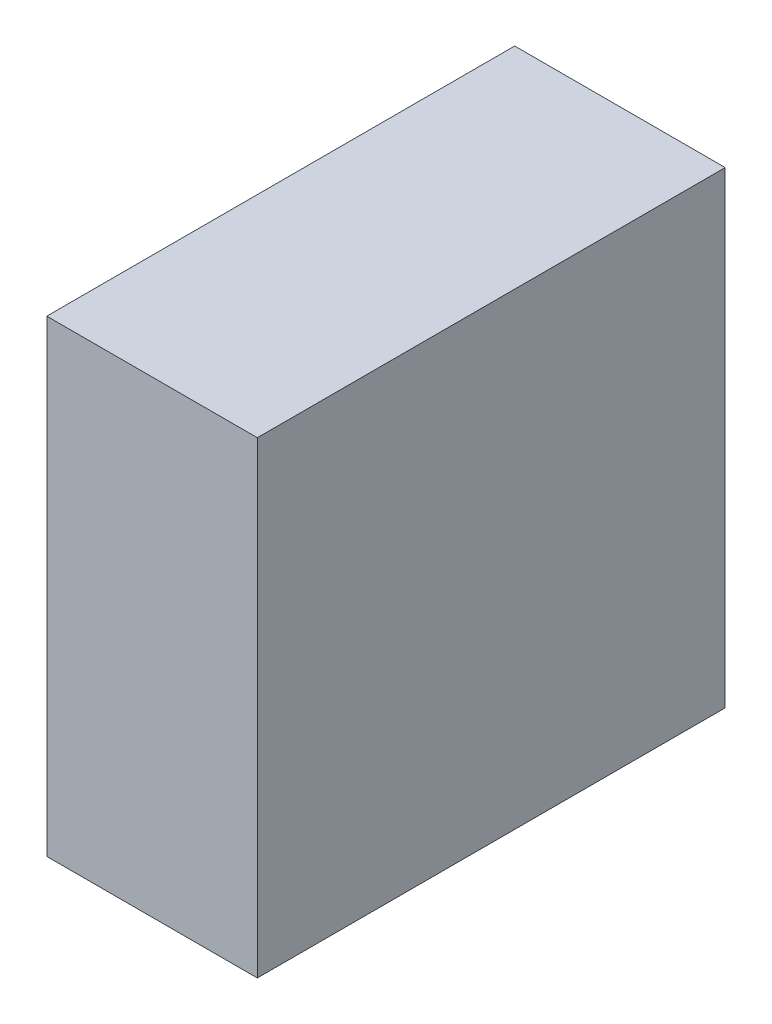
ISO-10303-21;
HEADER;
FILE_DESCRIPTION(('STEP AP214'),'2;1');
FILE_NAME('part.step','',(''),(''),'','','');
FILE_SCHEMA(('AUTOMOTIVE_DESIGN { 1 0 10303 214 1 1 1 1 }'));
ENDSEC;
DATA;
#1=APPLICATION_CONTEXT('core data for automotive mechanical design processes');
#2=APPLICATION_PROTOCOL_DEFINITION('international standard','automotive_design',2000,#1);
#3=PRODUCT_CONTEXT('',#1,'mechanical');
#4=PRODUCT('Part','Part','',(#3));
#5=PRODUCT_RELATED_PRODUCT_CATEGORY('part','',(#4));
#6=PRODUCT_DEFINITION_FORMATION('','',#4);
#7=PRODUCT_DEFINITION_CONTEXT('part definition',#1,'design');
#8=PRODUCT_DEFINITION('design','',#6,#7);
#9=PRODUCT_DEFINITION_SHAPE('','',#8);
#10=(LENGTH_UNIT() NAMED_UNIT(*) SI_UNIT(.MILLI.,.METRE.));
#11=(NAMED_UNIT(*) PLANE_ANGLE_UNIT() SI_UNIT($,.RADIAN.));
#12=(NAMED_UNIT(*) SI_UNIT($,.STERADIAN.) SOLID_ANGLE_UNIT());
#13=UNCERTAINTY_MEASURE_WITH_UNIT(LENGTH_MEASURE(1.E-05),#10,'distance_accuracy_value','');
#14=(GEOMETRIC_REPRESENTATION_CONTEXT(3) GLOBAL_UNCERTAINTY_ASSIGNED_CONTEXT((#13)) GLOBAL_UNIT_ASSIGNED_CONTEXT((#10,
#11,#12)) REPRESENTATION_CONTEXT('',''));
#15=CARTESIAN_POINT('',(0.,0.,0.));
#16=DIRECTION('',(0.,0.,1.));
#17=DIRECTION('',(1.,0.,0.));
#18=AXIS2_PLACEMENT_3D('',#15,#16,#17);
#19=CARTESIAN_POINT('',(390.,180.,-248.));
#20=DIRECTION('',(-1.,0.,0.));
#21=DIRECTION('',(0.,0.,1.));
#22=AXIS2_PLACEMENT_3D('',#19,#20,#21);
#23=PLANE('',#22);
#24=DIRECTION('',(0.,-1.,0.));
#25=VECTOR('',#24,1.);
#26=CARTESIAN_POINT('',(390.,180.,-148.));
#27=LINE('',#26,#25);
#28=CARTESIAN_POINT('',(390.,280.,-148.));
#29=VERTEX_POINT('',#28);
#30=CARTESIAN_POINT('',(390.,180.,-148.));
#31=VERTEX_POINT('',#30);
#32=EDGE_CURVE('E103',#29,#31,#27,.T.);
#33=ORIENTED_EDGE('',*,*,#32,.F.);
#34=DIRECTION('',(0.,0.,1.));
#35=VECTOR('',#34,1.);
#36=CARTESIAN_POINT('',(390.,280.,-248.));
#37=LINE('',#36,#35);
#38=CARTESIAN_POINT('',(390.,280.,-248.));
#39=VERTEX_POINT('',#38);
#40=EDGE_CURVE('E11',#39,#29,#37,.T.);
#41=ORIENTED_EDGE('',*,*,#40,.F.);
#42=DIRECTION('',(0.,-1.,0.));
#43=VECTOR('',#42,1.);
#44=CARTESIAN_POINT('',(390.,180.,-248.));
#45=LINE('',#44,#43);
#46=CARTESIAN_POINT('',(390.,180.,-248.));
#47=VERTEX_POINT('',#46);
#48=EDGE_CURVE('E97',#39,#47,#45,.T.);
#49=ORIENTED_EDGE('',*,*,#48,.T.);
#50=DIRECTION('',(0.,0.,1.));
#51=VECTOR('',#50,1.);
#52=CARTESIAN_POINT('',(390.,180.,-248.));
#53=LINE('',#52,#51);
#54=EDGE_CURVE('E42',#47,#31,#53,.T.);
#55=ORIENTED_EDGE('',*,*,#54,.T.);
#56=EDGE_LOOP('',(#33,#41,#49,#55));
#57=FACE_BOUND('',#56,.T.);
#58=ADVANCED_FACE('F39',(#57),#23,.T.);
#59=CARTESIAN_POINT('',(390.,280.,-248.));
#60=DIRECTION('',(0.,1.,0.));
#61=DIRECTION('',(0.,0.,1.));
#62=AXIS2_PLACEMENT_3D('',#59,#60,#61);
#63=PLANE('',#62);
#64=DIRECTION('',(-1.,0.,0.));
#65=VECTOR('',#64,1.);
#66=CARTESIAN_POINT('',(390.,280.,-148.));
#67=LINE('',#66,#65);
#68=CARTESIAN_POINT('',(435.,280.,-148.));
#69=VERTEX_POINT('',#68);
#70=EDGE_CURVE('E99',#69,#29,#67,.T.);
#71=ORIENTED_EDGE('',*,*,#70,.F.);
#72=DIRECTION('',(0.,0.,1.));
#73=VECTOR('',#72,1.);
#74=CARTESIAN_POINT('',(435.,280.,-248.));
#75=LINE('',#74,#73);
#76=CARTESIAN_POINT('',(435.,280.,-248.));
#77=VERTEX_POINT('',#76);
#78=EDGE_CURVE('E48',#77,#69,#75,.T.);
#79=ORIENTED_EDGE('',*,*,#78,.F.);
#80=DIRECTION('',(-1.,0.,0.));
#81=VECTOR('',#80,1.);
#82=CARTESIAN_POINT('',(390.,280.,-248.));
#83=LINE('',#82,#81);
#84=EDGE_CURVE('E94',#77,#39,#83,.T.);
#85=ORIENTED_EDGE('',*,*,#84,.T.);
#86=ORIENTED_EDGE('',*,*,#40,.T.);
#87=EDGE_LOOP('',(#71,#79,#85,#86));
#88=FACE_BOUND('',#87,.T.);
#89=ADVANCED_FACE('F113',(#88),#63,.T.);
#90=CARTESIAN_POINT('',(435.,180.,-248.));
#91=DIRECTION('',(1.,0.,0.));
#92=DIRECTION('',(0.,0.,-1.));
#93=AXIS2_PLACEMENT_3D('',#90,#91,#92);
#94=PLANE('',#93);
#95=DIRECTION('',(0.,1.,0.));
#96=VECTOR('',#95,1.);
#97=CARTESIAN_POINT('',(435.,180.,-148.));
#98=LINE('',#97,#96);
#99=CARTESIAN_POINT('',(435.,180.,-148.));
#100=VERTEX_POINT('',#99);
#101=EDGE_CURVE('E89',#100,#69,#98,.T.);
#102=ORIENTED_EDGE('',*,*,#101,.F.);
#103=DIRECTION('',(0.,0.,1.));
#104=VECTOR('',#103,1.);
#105=CARTESIAN_POINT('',(435.,180.,-248.));
#106=LINE('',#105,#104);
#107=CARTESIAN_POINT('',(435.,180.,-248.));
#108=VERTEX_POINT('',#107);
#109=EDGE_CURVE('E84',#108,#100,#106,.T.);
#110=ORIENTED_EDGE('',*,*,#109,.F.);
#111=DIRECTION('',(0.,1.,0.));
#112=VECTOR('',#111,1.);
#113=CARTESIAN_POINT('',(435.,180.,-248.));
#114=LINE('',#113,#112);
#115=EDGE_CURVE('E87',#108,#77,#114,.T.);
#116=ORIENTED_EDGE('',*,*,#115,.T.);
#117=ORIENTED_EDGE('',*,*,#78,.T.);
#118=EDGE_LOOP('',(#102,#110,#116,#117));
#119=FACE_BOUND('',#118,.T.);
#120=ADVANCED_FACE('F86',(#119),#94,.T.);
#121=CARTESIAN_POINT('',(390.,180.,-248.));
#122=DIRECTION('',(0.,-1.,0.));
#123=DIRECTION('',(0.,0.,-1.));
#124=AXIS2_PLACEMENT_3D('',#121,#122,#123);
#125=PLANE('',#124);
#126=DIRECTION('',(1.,0.,0.));
#127=VECTOR('',#126,1.);
#128=CARTESIAN_POINT('',(390.,180.,-148.));
#129=LINE('',#128,#127);
#130=EDGE_CURVE('E106',#31,#100,#129,.T.);
#131=ORIENTED_EDGE('',*,*,#130,.F.);
#132=ORIENTED_EDGE('',*,*,#54,.F.);
#133=DIRECTION('',(1.,0.,0.));
#134=VECTOR('',#133,1.);
#135=CARTESIAN_POINT('',(390.,180.,-248.));
#136=LINE('',#135,#134);
#137=EDGE_CURVE('E93',#47,#108,#136,.T.);
#138=ORIENTED_EDGE('',*,*,#137,.T.);
#139=ORIENTED_EDGE('',*,*,#109,.T.);
#140=EDGE_LOOP('',(#131,#132,#138,#139));
#141=FACE_BOUND('',#140,.T.);
#142=ADVANCED_FACE('F96',(#141),#125,.T.);
#143=CARTESIAN_POINT('',(0.,0.,-248.));
#144=DIRECTION('',(0.,0.,-1.));
#145=DIRECTION('',(-1.,0.,0.));
#146=AXIS2_PLACEMENT_3D('',#143,#144,#145);
#147=PLANE('',#146);
#148=ORIENTED_EDGE('',*,*,#48,.F.);
#149=ORIENTED_EDGE('',*,*,#84,.F.);
#150=ORIENTED_EDGE('',*,*,#115,.F.);
#151=ORIENTED_EDGE('',*,*,#137,.F.);
#152=EDGE_LOOP('',(#148,#149,#150,#151));
#153=FACE_BOUND('',#152,.T.);
#154=ADVANCED_FACE('F92',(#153),#147,.T.);
#155=CARTESIAN_POINT('',(0.,0.,-148.));
#156=DIRECTION('',(0.,0.,-1.));
#157=DIRECTION('',(-1.,0.,0.));
#158=AXIS2_PLACEMENT_3D('',#155,#156,#157);
#159=PLANE('',#158);
#160=ORIENTED_EDGE('',*,*,#32,.T.);
#161=ORIENTED_EDGE('',*,*,#130,.T.);
#162=ORIENTED_EDGE('',*,*,#101,.T.);
#163=ORIENTED_EDGE('',*,*,#70,.T.);
#164=EDGE_LOOP('',(#160,#161,#162,#163));
#165=FACE_BOUND('',#164,.T.);
#166=ADVANCED_FACE('F112',(#165),#159,.F.);
#167=CLOSED_SHELL('',(#58,#89,#120,#142,#154,#166));
#168=MANIFOLD_SOLID_BREP('B2',#167);
#169=ADVANCED_BREP_SHAPE_REPRESENTATION('',(#18,#168),#14);
#170=SHAPE_DEFINITION_REPRESENTATION(#9,#169);
ENDSEC;
END-ISO-10303-21;
